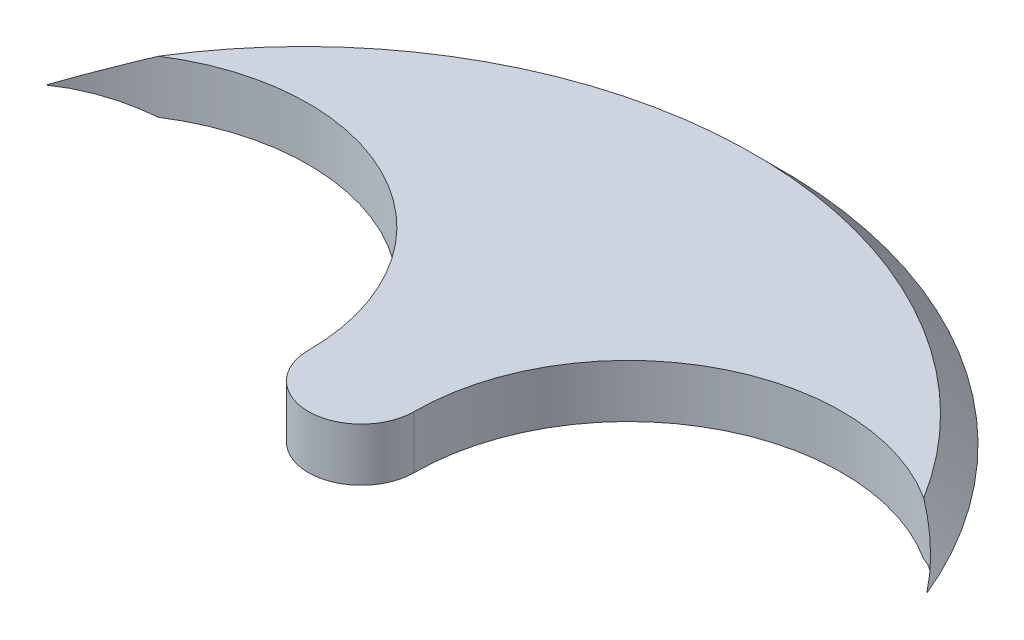
ISO-10303-21;
HEADER;
FILE_DESCRIPTION(('STEP AP214'),'2;1');
FILE_NAME('part.step','',(''),(''),'','','');
FILE_SCHEMA(('AUTOMOTIVE_DESIGN { 1 0 10303 214 1 1 1 1 }'));
ENDSEC;
DATA;
#1=APPLICATION_CONTEXT('core data for automotive mechanical design processes');
#2=APPLICATION_PROTOCOL_DEFINITION('international standard','automotive_design',2000,#1);
#3=PRODUCT_CONTEXT('',#1,'mechanical');
#4=PRODUCT('Part','Part','',(#3));
#5=PRODUCT_RELATED_PRODUCT_CATEGORY('part','',(#4));
#6=PRODUCT_DEFINITION_FORMATION('','',#4);
#7=PRODUCT_DEFINITION_CONTEXT('part definition',#1,'design');
#8=PRODUCT_DEFINITION('design','',#6,#7);
#9=PRODUCT_DEFINITION_SHAPE('','',#8);
#10=(LENGTH_UNIT() NAMED_UNIT(*) SI_UNIT(.MILLI.,.METRE.));
#11=(NAMED_UNIT(*) PLANE_ANGLE_UNIT() SI_UNIT($,.RADIAN.));
#12=(NAMED_UNIT(*) SI_UNIT($,.STERADIAN.) SOLID_ANGLE_UNIT());
#13=UNCERTAINTY_MEASURE_WITH_UNIT(LENGTH_MEASURE(1.E-05),#10,'distance_accuracy_value','');
#14=(GEOMETRIC_REPRESENTATION_CONTEXT(3) GLOBAL_UNCERTAINTY_ASSIGNED_CONTEXT((#13)) GLOBAL_UNIT_ASSIGNED_CONTEXT((#10,
#11,#12)) REPRESENTATION_CONTEXT('',''));
#15=CARTESIAN_POINT('',(0.,0.,0.));
#16=DIRECTION('',(0.,0.,1.));
#17=DIRECTION('',(1.,0.,0.));
#18=AXIS2_PLACEMENT_3D('',#15,#16,#17);
#19=CARTESIAN_POINT('',(-10.0774541830126,1.,-2.16478440058478));
#20=DIRECTION('',(0.,-1.,0.));
#21=DIRECTION('',(0.,0.,-1.));
#22=AXIS2_PLACEMENT_3D('',#19,#20,#21);
#23=CYLINDRICAL_SURFACE('',#22,8.07745418301265);
#24=CARTESIAN_POINT('',(-14.4488663661315,1.,-8.95713462741707));
#25=CARTESIAN_POINT('',(-14.6551679889321,0.894606982666131,-8.82441419030035));
#26=CARTESIAN_POINT('',(-14.8571985018148,0.794081545438585,-8.68104944422819));
#27=CARTESIAN_POINT('',(-15.2482766844981,0.604563139515869,-8.37515651875755));
#28=CARTESIAN_POINT('',(-15.4374322575067,0.515466728285352,-8.21283009087516));
#29=CARTESIAN_POINT('',(-15.8025122318363,0.348481426575358,-7.86846362476427));
#30=CARTESIAN_POINT('',(-15.9784330991044,0.270595524594331,-7.68641835246787));
#31=CARTESIAN_POINT('',(-16.2312083360656,0.162494752328532,-7.39862807618975));
#32=CARTESIAN_POINT('',(-16.3140029525294,0.127763837037086,-7.29970992244148));
#33=CARTESIAN_POINT('',(-16.4752489303954,0.0614773605504394,-7.09735251975228));
#34=CARTESIAN_POINT('',(-16.5536997655132,0.0299221837447966,-6.9939127256828));
#35=CARTESIAN_POINT('',(-16.6298315852032,0.,-6.88830178257157));
#36=B_SPLINE_CURVE_WITH_KNOTS('',3,(#24,#25,#26,#27,#28,#29,#30,#31,#32,#33,#34,#35),
.UNSPECIFIED.,.F.,.F.,(4,2,2,2,2,4),(0.,0.800767669812588,1.59368121635432,2.38680574791468,
2.78741118648986,3.18806505594637),.UNSPECIFIED.);
#37=CARTESIAN_POINT('',(-14.4488663661315,1.,-8.95713462741707));
#38=VERTEX_POINT('',#37);
#39=CARTESIAN_POINT('',(-16.6298315852032,0.,-6.88830178257157));
#40=VERTEX_POINT('',#39);
#41=EDGE_CURVE('E111',#38,#40,#36,.T.);
#42=ORIENTED_EDGE('',*,*,#41,.T.);
#43=CARTESIAN_POINT('',(-16.6298315852032,0.,-6.88830178257157));
#44=CARTESIAN_POINT('',(-16.5536997655132,-0.0299221837448034,-6.9939127256828));
#45=CARTESIAN_POINT('',(-16.4752489303954,-0.0614773605504465,-7.09735251975228));
#46=CARTESIAN_POINT('',(-16.3140029525294,-0.127763837037092,-7.29970992244148));
#47=CARTESIAN_POINT('',(-16.2312083360656,-0.162494752328537,-7.39862807618975));
#48=CARTESIAN_POINT('',(-15.9784330991044,-0.270595524594335,-7.68641835246787));
#49=CARTESIAN_POINT('',(-15.8025122318363,-0.348481426575361,-7.86846362476427));
#50=CARTESIAN_POINT('',(-15.4374322575067,-0.515466728285356,-8.21283009087516));
#51=CARTESIAN_POINT('',(-15.2482766844981,-0.604563139515874,-8.37515651875755));
#52=CARTESIAN_POINT('',(-14.8571985018148,-0.794081545438592,-8.68104944422819));
#53=CARTESIAN_POINT('',(-14.6551679889321,-0.894606982666137,-8.82441419030035));
#54=CARTESIAN_POINT('',(-14.4488663661315,-1.,-8.95713462741707));
#55=B_SPLINE_CURVE_WITH_KNOTS('',3,(#43,#44,#45,#46,#47,#48,#49,#50,#51,#52,#53,#54),
.UNSPECIFIED.,.F.,.F.,(4,2,2,2,2,4),(0.,0.400653869456505,0.801259308031685,1.59438383959205,
2.38729738613377,3.18806505594636),.UNSPECIFIED.);
#56=CARTESIAN_POINT('',(-14.4488663661315,-1.,-8.95713462741706));
#57=VERTEX_POINT('',#56);
#58=EDGE_CURVE('E113',#40,#57,#55,.T.);
#59=ORIENTED_EDGE('',*,*,#58,.T.);
#60=CARTESIAN_POINT('',(-10.0774541830126,-1.,-2.16478440058478));
#61=DIRECTION('',(0.,-1.,0.));
#62=DIRECTION('',(0.,0.,-1.));
#63=AXIS2_PLACEMENT_3D('',#60,#61,#62);
#64=CIRCLE('',#63,8.07745418301265);
#65=CARTESIAN_POINT('',(-2.,-1.,-2.16478440058478));
#66=VERTEX_POINT('',#65);
#67=EDGE_CURVE('E109',#57,#66,#64,.T.);
#68=ORIENTED_EDGE('',*,*,#67,.T.);
#69=DIRECTION('',(0.,-1.,0.));
#70=VECTOR('',#69,1.);
#71=CARTESIAN_POINT('',(-2.,1.,-2.16478440058478));
#72=LINE('',#71,#70);
#73=CARTESIAN_POINT('',(-2.,1.,-2.16478440058478));
#74=VERTEX_POINT('',#73);
#75=EDGE_CURVE('E103',#74,#66,#72,.T.);
#76=ORIENTED_EDGE('',*,*,#75,.F.);
#77=CARTESIAN_POINT('',(-10.0774541830126,1.,-2.16478440058478));
#78=DIRECTION('',(0.,-1.,0.));
#79=DIRECTION('',(0.,0.,-1.));
#80=AXIS2_PLACEMENT_3D('',#77,#78,#79);
#81=CIRCLE('',#80,8.07745418301265);
#82=EDGE_CURVE('E89',#38,#74,#81,.T.);
#83=ORIENTED_EDGE('',*,*,#82,.F.);
#84=EDGE_LOOP('',(#42,#59,#68,#76,#83));
#85=FACE_BOUND('',#84,.T.);
#86=ADVANCED_FACE('F43',(#85),#23,.F.);
#87=CARTESIAN_POINT('',(0.,1.,-2.16478440058478));
#88=DIRECTION('',(0.,-1.,0.));
#89=DIRECTION('',(0.,0.,-1.));
#90=AXIS2_PLACEMENT_3D('',#87,#88,#89);
#91=CYLINDRICAL_SURFACE('',#90,2.);
#92=CARTESIAN_POINT('',(0.,-1.,-2.16478440058478));
#93=DIRECTION('',(0.,1.,0.));
#94=DIRECTION('',(0.,0.,1.));
#95=AXIS2_PLACEMENT_3D('',#92,#93,#94);
#96=CIRCLE('',#95,2.);
#97=CARTESIAN_POINT('',(2.,-1.,-2.16478440058478));
#98=VERTEX_POINT('',#97);
#99=EDGE_CURVE('E227',#66,#98,#96,.T.);
#100=ORIENTED_EDGE('',*,*,#99,.T.);
#101=DIRECTION('',(0.,-1.,0.));
#102=VECTOR('',#101,1.);
#103=CARTESIAN_POINT('',(2.,1.,-2.16478440058478));
#104=LINE('',#103,#102);
#105=CARTESIAN_POINT('',(2.,1.,-2.16478440058478));
#106=VERTEX_POINT('',#105);
#107=EDGE_CURVE('E105',#106,#98,#104,.T.);
#108=ORIENTED_EDGE('',*,*,#107,.F.);
#109=CARTESIAN_POINT('',(0.,1.,-2.16478440058478));
#110=DIRECTION('',(0.,1.,0.));
#111=DIRECTION('',(0.,0.,1.));
#112=AXIS2_PLACEMENT_3D('',#109,#110,#111);
#113=CIRCLE('',#112,2.);
#114=EDGE_CURVE('E92',#74,#106,#113,.T.);
#115=ORIENTED_EDGE('',*,*,#114,.F.);
#116=ORIENTED_EDGE('',*,*,#75,.T.);
#117=EDGE_LOOP('',(#100,#108,#115,#116));
#118=FACE_BOUND('',#117,.T.);
#119=ADVANCED_FACE('F102',(#118),#91,.T.);
#120=CARTESIAN_POINT('',(10.0774541830126,1.,-2.16478440058478));
#121=DIRECTION('',(0.,-1.,0.));
#122=DIRECTION('',(0.,0.,-1.));
#123=AXIS2_PLACEMENT_3D('',#120,#121,#122);
#124=CYLINDRICAL_SURFACE('',#123,8.07745418301265);
#125=CARTESIAN_POINT('',(10.0774541830126,-1.,-2.16478440058478));
#126=DIRECTION('',(0.,-1.,0.));
#127=DIRECTION('',(0.,0.,1.));
#128=AXIS2_PLACEMENT_3D('',#125,#126,#127);
#129=CIRCLE('',#128,8.07745418301265);
#130=CARTESIAN_POINT('',(14.4488663661315,-1.,-8.95713462741707));
#131=VERTEX_POINT('',#130);
#132=EDGE_CURVE('E98',#98,#131,#129,.T.);
#133=ORIENTED_EDGE('',*,*,#132,.T.);
#134=CARTESIAN_POINT('',(14.4488663661315,-1.,-8.95713462741707));
#135=CARTESIAN_POINT('',(14.6551679889321,-0.894606982666135,-8.82441419030035));
#136=CARTESIAN_POINT('',(14.8571985018148,-0.794081545438589,-8.68104944422819));
#137=CARTESIAN_POINT('',(15.2482766844981,-0.60456313951587,-8.37515651875755));
#138=CARTESIAN_POINT('',(15.4374322575067,-0.515466728285351,-8.21283009087517));
#139=CARTESIAN_POINT('',(15.8025122318363,-0.348481426575359,-7.86846362476427));
#140=CARTESIAN_POINT('',(15.9784330991044,-0.270595524594335,-7.68641835246787));
#141=CARTESIAN_POINT('',(16.2312083360656,-0.162494752328537,-7.39862807618975));
#142=CARTESIAN_POINT('',(16.3140029525294,-0.12776383703709,-7.29970992244149));
#143=CARTESIAN_POINT('',(16.4752489303954,-0.0614773605504428,-7.09735251975228));
#144=CARTESIAN_POINT('',(16.5536997655132,-0.0299221837448002,-6.9939127256828));
#145=CARTESIAN_POINT('',(16.6298315852032,0.,-6.88830178257157));
#146=B_SPLINE_CURVE_WITH_KNOTS('',3,(#134,#135,#136,#137,#138,#139,#140,#141,#142,#143,#144,
#145),.UNSPECIFIED.,.F.,.F.,(4,2,2,2,2,4),(0.,0.800767669812588,1.59368121635432,
2.38680574791467,2.78741118648986,3.18806505594636),.UNSPECIFIED.);
#147=CARTESIAN_POINT('',(16.6298315852032,0.,-6.88830178257157));
#148=VERTEX_POINT('',#147);
#149=EDGE_CURVE('E54',#131,#148,#146,.T.);
#150=ORIENTED_EDGE('',*,*,#149,.T.);
#151=CARTESIAN_POINT('',(16.6298315852032,0.,-6.88830178257157));
#152=CARTESIAN_POINT('',(16.5536997655132,0.0299221837447935,-6.9939127256828));
#153=CARTESIAN_POINT('',(16.4752489303954,0.0614773605504361,-7.09735251975228));
#154=CARTESIAN_POINT('',(16.3140029525294,0.127763837037083,-7.29970992244149));
#155=CARTESIAN_POINT('',(16.2312083360656,0.16249475232853,-7.39862807618975));
#156=CARTESIAN_POINT('',(15.9784330991044,0.27059552459433,-7.68641835246787));
#157=CARTESIAN_POINT('',(15.8025122318363,0.348481426575356,-7.86846362476427));
#158=CARTESIAN_POINT('',(15.4374322575067,0.51546672828535,-8.21283009087517));
#159=CARTESIAN_POINT('',(15.2482766844981,0.604563139515868,-8.37515651875756));
#160=CARTESIAN_POINT('',(14.8571985018148,0.794081545438586,-8.6810494442282));
#161=CARTESIAN_POINT('',(14.6551679889321,0.894606982666132,-8.82441419030036));
#162=CARTESIAN_POINT('',(14.4488663661315,1.,-8.95713462741708));
#163=B_SPLINE_CURVE_WITH_KNOTS('',3,(#151,#152,#153,#154,#155,#156,#157,#158,#159,#160,#161,
#162),.UNSPECIFIED.,.F.,.F.,(4,2,2,2,2,4),(0.,0.400653869456505,0.801259308031688,
1.59438383959205,2.38729738613378,3.18806505594637),.UNSPECIFIED.);
#164=CARTESIAN_POINT('',(14.4488663661315,1.,-8.95713462741707));
#165=VERTEX_POINT('',#164);
#166=EDGE_CURVE('E61',#148,#165,#163,.T.);
#167=ORIENTED_EDGE('',*,*,#166,.T.);
#168=CARTESIAN_POINT('',(10.0774541830126,1.,-2.16478440058478));
#169=DIRECTION('',(0.,-1.,0.));
#170=DIRECTION('',(0.,0.,1.));
#171=AXIS2_PLACEMENT_3D('',#168,#169,#170);
#172=CIRCLE('',#171,8.07745418301265);
#173=EDGE_CURVE('E106',#106,#165,#172,.T.);
#174=ORIENTED_EDGE('',*,*,#173,.F.);
#175=ORIENTED_EDGE('',*,*,#107,.T.);
#176=EDGE_LOOP('',(#133,#150,#167,#174,#175));
#177=FACE_BOUND('',#176,.T.);
#178=ADVANCED_FACE('F151',(#177),#124,.F.);
#179=CARTESIAN_POINT('',(-5.03872709150632,1.,-2.16478440058478));
#180=DIRECTION('',(0.,-1.,0.));
#181=DIRECTION('',(0.,0.,-1.));
#182=AXIS2_PLACEMENT_3D('',#179,#180,#181);
#183=PLANE('',#182);
#184=ORIENTED_EDGE('',*,*,#173,.T.);
#185=CARTESIAN_POINT('',(0.,1.,0.));
#186=DIRECTION('',(0.,-1.,0.));
#187=DIRECTION('',(0.,0.,-1.));
#188=AXIS2_PLACEMENT_3D('',#185,#186,#187);
#189=CIRCLE('',#188,17.);
#190=EDGE_CURVE('E11',#165,#38,#189,.F.);
#191=ORIENTED_EDGE('',*,*,#190,.T.);
#192=ORIENTED_EDGE('',*,*,#82,.T.);
#193=ORIENTED_EDGE('',*,*,#114,.T.);
#194=EDGE_LOOP('',(#184,#191,#192,#193));
#195=FACE_BOUND('',#194,.T.);
#196=ADVANCED_FACE('F91',(#195),#183,.F.);
#197=CARTESIAN_POINT('',(-5.03872709150632,-1.,-2.16478440058478));
#198=DIRECTION('',(0.,-1.,0.));
#199=DIRECTION('',(0.,0.,-1.));
#200=AXIS2_PLACEMENT_3D('',#197,#198,#199);
#201=PLANE('',#200);
#202=ORIENTED_EDGE('',*,*,#67,.F.);
#203=CARTESIAN_POINT('',(0.,-1.,0.));
#204=DIRECTION('',(0.,-1.,0.));
#205=DIRECTION('',(0.,0.,-1.));
#206=AXIS2_PLACEMENT_3D('',#203,#204,#205);
#207=CIRCLE('',#206,17.);
#208=EDGE_CURVE('E224',#57,#131,#207,.T.);
#209=ORIENTED_EDGE('',*,*,#208,.T.);
#210=ORIENTED_EDGE('',*,*,#132,.F.);
#211=ORIENTED_EDGE('',*,*,#99,.F.);
#212=EDGE_LOOP('',(#202,#209,#210,#211));
#213=FACE_BOUND('',#212,.T.);
#214=ADVANCED_FACE('F155',(#213),#201,.T.);
#215=CARTESIAN_POINT('',(0.,1.,0.));
#216=DIRECTION('',(0.,-1.,0.));
#217=DIRECTION('',(0.,0.,-1.));
#218=AXIS2_PLACEMENT_3D('',#215,#216,#217);
#219=CONICAL_SURFACE('',#218,17.,0.78539816339745);
#220=ORIENTED_EDGE('',*,*,#190,.F.);
#221=ORIENTED_EDGE('',*,*,#166,.F.);
#222=CARTESIAN_POINT('',(0.,0.,0.));
#223=DIRECTION('',(0.,-1.,0.));
#224=DIRECTION('',(0.,0.,-1.));
#225=AXIS2_PLACEMENT_3D('',#222,#223,#224);
#226=CIRCLE('',#225,18.);
#227=EDGE_CURVE('E49',#40,#148,#226,.T.);
#228=ORIENTED_EDGE('',*,*,#227,.F.);
#229=ORIENTED_EDGE('',*,*,#41,.F.);
#230=EDGE_LOOP('',(#220,#221,#228,#229));
#231=FACE_BOUND('',#230,.T.);
#232=ADVANCED_FACE('F46',(#231),#219,.T.);
#233=CARTESIAN_POINT('',(0.,0.,0.));
#234=DIRECTION('',(0.,1.,0.));
#235=DIRECTION('',(0.,0.,1.));
#236=AXIS2_PLACEMENT_3D('',#233,#234,#235);
#237=CONICAL_SURFACE('',#236,18.,0.785398163397452);
#238=ORIENTED_EDGE('',*,*,#149,.F.);
#239=ORIENTED_EDGE('',*,*,#208,.F.);
#240=ORIENTED_EDGE('',*,*,#58,.F.);
#241=ORIENTED_EDGE('',*,*,#227,.T.);
#242=EDGE_LOOP('',(#238,#239,#240,#241));
#243=FACE_BOUND('',#242,.T.);
#244=ADVANCED_FACE('F133',(#243),#237,.T.);
#245=CLOSED_SHELL('',(#86,#119,#178,#196,#214,#232,#244));
#246=MANIFOLD_SOLID_BREP('B2',#245);
#247=ADVANCED_BREP_SHAPE_REPRESENTATION('',(#18,#246),#14);
#248=SHAPE_DEFINITION_REPRESENTATION(#9,#247);
ENDSEC;
END-ISO-10303-21;
